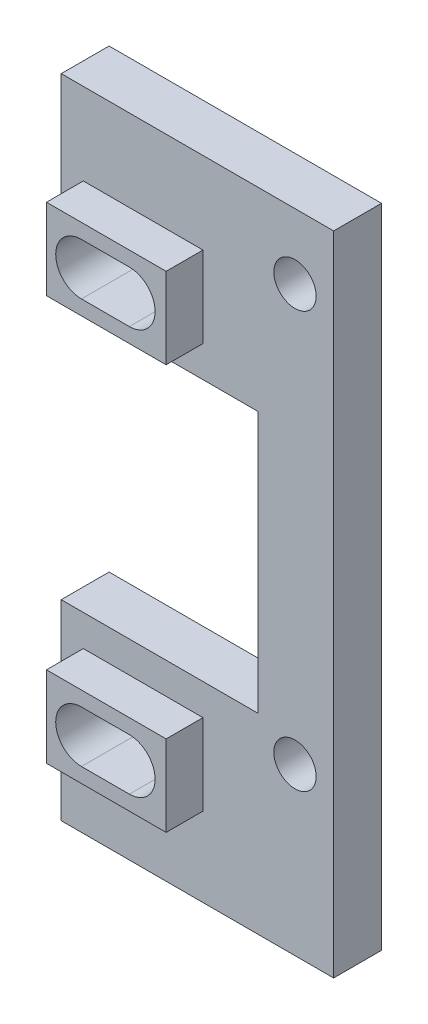
ISO-10303-21;
HEADER;
FILE_DESCRIPTION(('STEP AP214'),'2;1');
FILE_NAME('part.step','',(''),(''),'','','');
FILE_SCHEMA(('AUTOMOTIVE_DESIGN { 1 0 10303 214 1 1 1 1 }'));
ENDSEC;
DATA;
#1=APPLICATION_CONTEXT('core data for automotive mechanical design processes');
#2=APPLICATION_PROTOCOL_DEFINITION('international standard','automotive_design',2000,#1);
#3=PRODUCT_CONTEXT('',#1,'mechanical');
#4=PRODUCT('Part','Part','',(#3));
#5=PRODUCT_RELATED_PRODUCT_CATEGORY('part','',(#4));
#6=PRODUCT_DEFINITION_FORMATION('','',#4);
#7=PRODUCT_DEFINITION_CONTEXT('part definition',#1,'design');
#8=PRODUCT_DEFINITION('design','',#6,#7);
#9=PRODUCT_DEFINITION_SHAPE('','',#8);
#10=(LENGTH_UNIT() NAMED_UNIT(*) SI_UNIT(.MILLI.,.METRE.));
#11=(NAMED_UNIT(*) PLANE_ANGLE_UNIT() SI_UNIT($,.RADIAN.));
#12=(NAMED_UNIT(*) SI_UNIT($,.STERADIAN.) SOLID_ANGLE_UNIT());
#13=UNCERTAINTY_MEASURE_WITH_UNIT(LENGTH_MEASURE(1.E-05),#10,'distance_accuracy_value','');
#14=(GEOMETRIC_REPRESENTATION_CONTEXT(3) GLOBAL_UNCERTAINTY_ASSIGNED_CONTEXT((#13)) GLOBAL_UNIT_ASSIGNED_CONTEXT((#10,
#11,#12)) REPRESENTATION_CONTEXT('',''));
#15=CARTESIAN_POINT('',(0.,0.,0.));
#16=DIRECTION('',(0.,0.,1.));
#17=DIRECTION('',(1.,0.,0.));
#18=AXIS2_PLACEMENT_3D('',#15,#16,#17);
#19=CARTESIAN_POINT('',(0.,0.,2.6));
#20=DIRECTION('',(0.,0.,1.));
#21=DIRECTION('',(1.,0.,0.));
#22=AXIS2_PLACEMENT_3D('',#19,#20,#21);
#23=PLANE('',#22);
#24=DIRECTION('',(1.,0.,0.));
#25=VECTOR('',#24,1.);
#26=CARTESIAN_POINT('',(26.9,-27.7,2.6));
#27=LINE('',#26,#25);
#28=CARTESIAN_POINT('',(26.9,-27.7,2.6));
#29=VERTEX_POINT('',#28);
#30=CARTESIAN_POINT('',(33.4,-27.7,2.6));
#31=VERTEX_POINT('',#30);
#32=EDGE_CURVE('E269',#29,#31,#27,.T.);
#33=ORIENTED_EDGE('',*,*,#32,.F.);
#34=DIRECTION('',(0.,-1.,0.));
#35=VECTOR('',#34,1.);
#36=CARTESIAN_POINT('',(26.9,-23.3,2.6));
#37=LINE('',#36,#35);
#38=CARTESIAN_POINT('',(26.9,-23.3,2.6));
#39=VERTEX_POINT('',#38);
#40=EDGE_CURVE('E255',#39,#29,#37,.T.);
#41=ORIENTED_EDGE('',*,*,#40,.F.);
#42=DIRECTION('',(-1.,0.,0.));
#43=VECTOR('',#42,1.);
#44=CARTESIAN_POINT('',(33.4,-23.3,2.6));
#45=LINE('',#44,#43);
#46=CARTESIAN_POINT('',(33.4,-23.3,2.6));
#47=VERTEX_POINT('',#46);
#48=EDGE_CURVE('E260',#47,#39,#45,.T.);
#49=ORIENTED_EDGE('',*,*,#48,.F.);
#50=DIRECTION('',(0.,1.,0.));
#51=VECTOR('',#50,1.);
#52=CARTESIAN_POINT('',(33.4,-27.7,2.6));
#53=LINE('',#52,#51);
#54=EDGE_CURVE('E271',#31,#47,#53,.T.);
#55=ORIENTED_EDGE('',*,*,#54,.F.);
#56=EDGE_LOOP('',(#33,#41,#49,#55));
#57=FACE_BOUND('',#56,.T.);
#58=CARTESIAN_POINT('',(38.4,-23.,2.6));
#59=DIRECTION('',(0.,0.,1.));
#60=DIRECTION('',(1.,0.,0.));
#61=AXIS2_PLACEMENT_3D('',#58,#59,#60);
#62=CIRCLE('',#61,1.15);
#63=CARTESIAN_POINT('',(39.55,-23.,2.6));
#64=VERTEX_POINT('',#63);
#65=EDGE_CURVE('E325',#64,#64,#62,.T.);
#66=ORIENTED_EDGE('',*,*,#65,.F.);
#67=EDGE_LOOP('',(#66));
#68=FACE_BOUND('',#67,.T.);
#69=DIRECTION('',(0.,-1.,0.));
#70=VECTOR('',#69,1.);
#71=CARTESIAN_POINT('',(25.7,-21.6,2.6));
#72=LINE('',#71,#70);
#73=CARTESIAN_POINT('',(25.7,-21.6,2.6));
#74=VERTEX_POINT('',#73);
#75=CARTESIAN_POINT('',(25.7,-32.,2.6));
#76=VERTEX_POINT('',#75);
#77=EDGE_CURVE('E331',#74,#76,#72,.T.);
#78=ORIENTED_EDGE('',*,*,#77,.T.);
#79=DIRECTION('',(1.,0.,0.));
#80=VECTOR('',#79,1.);
#81=CARTESIAN_POINT('',(25.7,-32.,2.6));
#82=LINE('',#81,#80);
#83=CARTESIAN_POINT('',(40.5,-32.,2.6));
#84=VERTEX_POINT('',#83);
#85=EDGE_CURVE('E334',#76,#84,#82,.T.);
#86=ORIENTED_EDGE('',*,*,#85,.T.);
#87=DIRECTION('',(0.,1.,0.));
#88=VECTOR('',#87,1.);
#89=CARTESIAN_POINT('',(40.5,-32.,2.6));
#90=LINE('',#89,#88);
#91=CARTESIAN_POINT('',(40.5,3.15,2.6));
#92=VERTEX_POINT('',#91);
#93=EDGE_CURVE('E337',#84,#92,#90,.T.);
#94=ORIENTED_EDGE('',*,*,#93,.T.);
#95=DIRECTION('',(-1.,0.,0.));
#96=VECTOR('',#95,1.);
#97=CARTESIAN_POINT('',(40.5,3.15,2.6));
#98=LINE('',#97,#96);
#99=CARTESIAN_POINT('',(25.7,3.15,2.6));
#100=VERTEX_POINT('',#99);
#101=EDGE_CURVE('E339',#92,#100,#98,.T.);
#102=ORIENTED_EDGE('',*,*,#101,.T.);
#103=DIRECTION('',(0.,-1.,0.));
#104=VECTOR('',#103,1.);
#105=CARTESIAN_POINT('',(25.7,3.15,2.6));
#106=LINE('',#105,#104);
#107=CARTESIAN_POINT('',(25.7,-7.4,2.6));
#108=VERTEX_POINT('',#107);
#109=EDGE_CURVE('E341',#100,#108,#106,.T.);
#110=ORIENTED_EDGE('',*,*,#109,.T.);
#111=DIRECTION('',(1.,0.,0.));
#112=VECTOR('',#111,1.);
#113=CARTESIAN_POINT('',(25.7,-7.4,2.6));
#114=LINE('',#113,#112);
#115=CARTESIAN_POINT('',(36.4,-7.4,2.6));
#116=VERTEX_POINT('',#115);
#117=EDGE_CURVE('E343',#108,#116,#114,.T.);
#118=ORIENTED_EDGE('',*,*,#117,.T.);
#119=DIRECTION('',(0.,-1.,0.));
#120=VECTOR('',#119,1.);
#121=CARTESIAN_POINT('',(36.4,-7.4,2.6));
#122=LINE('',#121,#120);
#123=CARTESIAN_POINT('',(36.4,-21.6,2.6));
#124=VERTEX_POINT('',#123);
#125=EDGE_CURVE('E345',#116,#124,#122,.T.);
#126=ORIENTED_EDGE('',*,*,#125,.T.);
#127=DIRECTION('',(-1.,0.,0.));
#128=VECTOR('',#127,1.);
#129=CARTESIAN_POINT('',(36.4,-21.6,2.6));
#130=LINE('',#129,#128);
#131=EDGE_CURVE('E347',#124,#74,#130,.T.);
#132=ORIENTED_EDGE('',*,*,#131,.T.);
#133=EDGE_LOOP('',(#78,#86,#94,#102,#110,#118,#126,#132));
#134=FACE_BOUND('',#133,.T.);
#135=CARTESIAN_POINT('',(38.4,-0.4,2.6));
#136=DIRECTION('',(0.,0.,1.));
#137=DIRECTION('',(1.,0.,0.));
#138=AXIS2_PLACEMENT_3D('',#135,#136,#137);
#139=CIRCLE('',#138,1.15);
#140=CARTESIAN_POINT('',(39.55,-0.4,2.6));
#141=VERTEX_POINT('',#140);
#142=EDGE_CURVE('E319',#141,#141,#139,.T.);
#143=ORIENTED_EDGE('',*,*,#142,.F.);
#144=EDGE_LOOP('',(#143));
#145=FACE_BOUND('',#144,.T.);
#146=DIRECTION('',(1.,0.,0.));
#147=VECTOR('',#146,1.);
#148=CARTESIAN_POINT('',(26.9,-5.7,2.6));
#149=LINE('',#148,#147);
#150=CARTESIAN_POINT('',(26.9,-5.7,2.6));
#151=VERTEX_POINT('',#150);
#152=CARTESIAN_POINT('',(33.4,-5.7,2.6));
#153=VERTEX_POINT('',#152);
#154=EDGE_CURVE('E235',#151,#153,#149,.T.);
#155=ORIENTED_EDGE('',*,*,#154,.F.);
#156=DIRECTION('',(0.,-1.,0.));
#157=VECTOR('',#156,1.);
#158=CARTESIAN_POINT('',(26.9,-1.3,2.6));
#159=LINE('',#158,#157);
#160=CARTESIAN_POINT('',(26.9,-1.3,2.6));
#161=VERTEX_POINT('',#160);
#162=EDGE_CURVE('E232',#161,#151,#159,.T.);
#163=ORIENTED_EDGE('',*,*,#162,.F.);
#164=DIRECTION('',(-1.,0.,0.));
#165=VECTOR('',#164,1.);
#166=CARTESIAN_POINT('',(33.4,-1.3,2.6));
#167=LINE('',#166,#165);
#168=CARTESIAN_POINT('',(33.4,-1.3,2.6));
#169=VERTEX_POINT('',#168);
#170=EDGE_CURVE('E746',#169,#161,#167,.T.);
#171=ORIENTED_EDGE('',*,*,#170,.F.);
#172=DIRECTION('',(0.,1.,0.));
#173=VECTOR('',#172,1.);
#174=CARTESIAN_POINT('',(33.4,-5.7,2.6));
#175=LINE('',#174,#173);
#176=EDGE_CURVE('E753',#153,#169,#175,.T.);
#177=ORIENTED_EDGE('',*,*,#176,.F.);
#178=EDGE_LOOP('',(#155,#163,#171,#177));
#179=FACE_BOUND('',#178,.T.);
#180=ADVANCED_FACE('F43',(#57,#68,#134,#145,#179),#23,.T.);
#181=CARTESIAN_POINT('',(0.,0.,0.));
#182=DIRECTION('',(0.,0.,1.));
#183=DIRECTION('',(1.,0.,0.));
#184=AXIS2_PLACEMENT_3D('',#181,#182,#183);
#185=PLANE('',#184);
#186=CARTESIAN_POINT('',(28.8,-25.5,0.));
#187=DIRECTION('',(0.,0.,1.));
#188=DIRECTION('',(1.,0.,0.));
#189=AXIS2_PLACEMENT_3D('',#186,#187,#188);
#190=CIRCLE('',#189,1.4);
#191=CARTESIAN_POINT('',(28.8,-24.1,0.));
#192=VERTEX_POINT('',#191);
#193=CARTESIAN_POINT('',(28.8,-26.9,0.));
#194=VERTEX_POINT('',#193);
#195=EDGE_CURVE('E296',#192,#194,#190,.T.);
#196=ORIENTED_EDGE('',*,*,#195,.T.);
#197=DIRECTION('',(1.,0.,0.));
#198=VECTOR('',#197,1.);
#199=CARTESIAN_POINT('',(28.8,-26.9,0.));
#200=LINE('',#199,#198);
#201=CARTESIAN_POINT('',(31.4,-26.9,0.));
#202=VERTEX_POINT('',#201);
#203=EDGE_CURVE('E299',#194,#202,#200,.T.);
#204=ORIENTED_EDGE('',*,*,#203,.T.);
#205=CARTESIAN_POINT('',(31.4,-25.5,0.));
#206=DIRECTION('',(0.,0.,1.));
#207=DIRECTION('',(1.,0.,0.));
#208=AXIS2_PLACEMENT_3D('',#205,#206,#207);
#209=CIRCLE('',#208,1.4);
#210=CARTESIAN_POINT('',(31.4,-24.1,0.));
#211=VERTEX_POINT('',#210);
#212=EDGE_CURVE('E302',#202,#211,#209,.T.);
#213=ORIENTED_EDGE('',*,*,#212,.T.);
#214=DIRECTION('',(-1.,0.,0.));
#215=VECTOR('',#214,1.);
#216=CARTESIAN_POINT('',(31.4,-24.1,0.));
#217=LINE('',#216,#215);
#218=EDGE_CURVE('E305',#211,#192,#217,.T.);
#219=ORIENTED_EDGE('',*,*,#218,.T.);
#220=EDGE_LOOP('',(#196,#204,#213,#219));
#221=FACE_BOUND('',#220,.T.);
#222=DIRECTION('',(0.,-1.,0.));
#223=VECTOR('',#222,1.);
#224=CARTESIAN_POINT('',(25.7,-21.6,0.));
#225=LINE('',#224,#223);
#226=CARTESIAN_POINT('',(25.7,-21.6,0.));
#227=VERTEX_POINT('',#226);
#228=CARTESIAN_POINT('',(25.7,-32.,0.));
#229=VERTEX_POINT('',#228);
#230=EDGE_CURVE('E328',#227,#229,#225,.T.);
#231=ORIENTED_EDGE('',*,*,#230,.F.);
#232=DIRECTION('',(-1.,0.,0.));
#233=VECTOR('',#232,1.);
#234=CARTESIAN_POINT('',(36.4,-21.6,0.));
#235=LINE('',#234,#233);
#236=CARTESIAN_POINT('',(36.4,-21.6,0.));
#237=VERTEX_POINT('',#236);
#238=EDGE_CURVE('E335',#237,#227,#235,.T.);
#239=ORIENTED_EDGE('',*,*,#238,.F.);
#240=DIRECTION('',(0.,-1.,0.));
#241=VECTOR('',#240,1.);
#242=CARTESIAN_POINT('',(36.4,-7.4,0.));
#243=LINE('',#242,#241);
#244=CARTESIAN_POINT('',(36.4,-7.4,0.));
#245=VERTEX_POINT('',#244);
#246=EDGE_CURVE('E362',#245,#237,#243,.T.);
#247=ORIENTED_EDGE('',*,*,#246,.F.);
#248=DIRECTION('',(1.,0.,0.));
#249=VECTOR('',#248,1.);
#250=CARTESIAN_POINT('',(25.7,-7.4,0.));
#251=LINE('',#250,#249);
#252=CARTESIAN_POINT('',(25.7,-7.4,0.));
#253=VERTEX_POINT('',#252);
#254=EDGE_CURVE('E360',#253,#245,#251,.T.);
#255=ORIENTED_EDGE('',*,*,#254,.F.);
#256=DIRECTION('',(0.,-1.,0.));
#257=VECTOR('',#256,1.);
#258=CARTESIAN_POINT('',(25.7,3.15,0.));
#259=LINE('',#258,#257);
#260=CARTESIAN_POINT('',(25.7,3.15,0.));
#261=VERTEX_POINT('',#260);
#262=EDGE_CURVE('E358',#261,#253,#259,.T.);
#263=ORIENTED_EDGE('',*,*,#262,.F.);
#264=DIRECTION('',(-1.,0.,0.));
#265=VECTOR('',#264,1.);
#266=CARTESIAN_POINT('',(40.5,3.15,0.));
#267=LINE('',#266,#265);
#268=CARTESIAN_POINT('',(40.5,3.15,0.));
#269=VERTEX_POINT('',#268);
#270=EDGE_CURVE('E356',#269,#261,#267,.T.);
#271=ORIENTED_EDGE('',*,*,#270,.F.);
#272=DIRECTION('',(0.,1.,0.));
#273=VECTOR('',#272,1.);
#274=CARTESIAN_POINT('',(40.5,-32.,0.));
#275=LINE('',#274,#273);
#276=CARTESIAN_POINT('',(40.5,-32.,0.));
#277=VERTEX_POINT('',#276);
#278=EDGE_CURVE('E354',#277,#269,#275,.T.);
#279=ORIENTED_EDGE('',*,*,#278,.F.);
#280=DIRECTION('',(1.,0.,0.));
#281=VECTOR('',#280,1.);
#282=CARTESIAN_POINT('',(25.7,-32.,0.));
#283=LINE('',#282,#281);
#284=EDGE_CURVE('E352',#229,#277,#283,.T.);
#285=ORIENTED_EDGE('',*,*,#284,.F.);
#286=EDGE_LOOP('',(#231,#239,#247,#255,#263,#271,#279,#285));
#287=FACE_BOUND('',#286,.T.);
#288=CARTESIAN_POINT('',(38.4,-23.,0.));
#289=DIRECTION('',(0.,0.,1.));
#290=DIRECTION('',(1.,0.,0.));
#291=AXIS2_PLACEMENT_3D('',#288,#289,#290);
#292=CIRCLE('',#291,1.15);
#293=CARTESIAN_POINT('',(39.55,-23.,0.));
#294=VERTEX_POINT('',#293);
#295=EDGE_CURVE('E322',#294,#294,#292,.T.);
#296=ORIENTED_EDGE('',*,*,#295,.T.);
#297=EDGE_LOOP('',(#296));
#298=FACE_BOUND('',#297,.T.);
#299=CARTESIAN_POINT('',(38.4,-0.4,0.));
#300=DIRECTION('',(0.,0.,1.));
#301=DIRECTION('',(1.,0.,0.));
#302=AXIS2_PLACEMENT_3D('',#299,#300,#301);
#303=CIRCLE('',#302,1.15);
#304=CARTESIAN_POINT('',(39.55,-0.4,0.));
#305=VERTEX_POINT('',#304);
#306=EDGE_CURVE('E318',#305,#305,#303,.T.);
#307=ORIENTED_EDGE('',*,*,#306,.T.);
#308=EDGE_LOOP('',(#307));
#309=FACE_BOUND('',#308,.T.);
#310=CARTESIAN_POINT('',(28.8,-3.5,0.));
#311=DIRECTION('',(0.,0.,1.));
#312=DIRECTION('',(1.,0.,0.));
#313=AXIS2_PLACEMENT_3D('',#310,#311,#312);
#314=CIRCLE('',#313,1.4);
#315=CARTESIAN_POINT('',(28.8,-2.1,0.));
#316=VERTEX_POINT('',#315);
#317=CARTESIAN_POINT('',(28.8,-4.9,0.));
#318=VERTEX_POINT('',#317);
#319=EDGE_CURVE('E282',#316,#318,#314,.T.);
#320=ORIENTED_EDGE('',*,*,#319,.T.);
#321=DIRECTION('',(1.,0.,0.));
#322=VECTOR('',#321,1.);
#323=CARTESIAN_POINT('',(28.8,-4.9,0.));
#324=LINE('',#323,#322);
#325=CARTESIAN_POINT('',(31.4,-4.9,0.));
#326=VERTEX_POINT('',#325);
#327=EDGE_CURVE('E285',#318,#326,#324,.T.);
#328=ORIENTED_EDGE('',*,*,#327,.T.);
#329=CARTESIAN_POINT('',(31.4,-3.5,0.));
#330=DIRECTION('',(0.,0.,1.));
#331=DIRECTION('',(1.,0.,0.));
#332=AXIS2_PLACEMENT_3D('',#329,#330,#331);
#333=CIRCLE('',#332,1.4);
#334=CARTESIAN_POINT('',(31.4,-2.1,0.));
#335=VERTEX_POINT('',#334);
#336=EDGE_CURVE('E288',#326,#335,#333,.T.);
#337=ORIENTED_EDGE('',*,*,#336,.T.);
#338=DIRECTION('',(-1.,0.,0.));
#339=VECTOR('',#338,1.);
#340=CARTESIAN_POINT('',(31.4,-2.1,0.));
#341=LINE('',#340,#339);
#342=EDGE_CURVE('E214',#335,#316,#341,.T.);
#343=ORIENTED_EDGE('',*,*,#342,.T.);
#344=EDGE_LOOP('',(#320,#328,#337,#343));
#345=FACE_BOUND('',#344,.T.);
#346=ADVANCED_FACE('F392',(#221,#287,#298,#309,#345),#185,.F.);
#347=CARTESIAN_POINT('',(25.7,-21.6,2.6));
#348=DIRECTION('',(1.,0.,0.));
#349=DIRECTION('',(0.,0.,-1.));
#350=AXIS2_PLACEMENT_3D('',#347,#348,#349);
#351=PLANE('',#350);
#352=ORIENTED_EDGE('',*,*,#230,.T.);
#353=DIRECTION('',(0.,0.,-1.));
#354=VECTOR('',#353,1.);
#355=CARTESIAN_POINT('',(25.7,-32.,2.6));
#356=LINE('',#355,#354);
#357=EDGE_CURVE('E11',#76,#229,#356,.T.);
#358=ORIENTED_EDGE('',*,*,#357,.F.);
#359=ORIENTED_EDGE('',*,*,#77,.F.);
#360=DIRECTION('',(0.,0.,-1.));
#361=VECTOR('',#360,1.);
#362=CARTESIAN_POINT('',(25.7,-21.6,2.6));
#363=LINE('',#362,#361);
#364=EDGE_CURVE('E349',#74,#227,#363,.T.);
#365=ORIENTED_EDGE('',*,*,#364,.T.);
#366=EDGE_LOOP('',(#352,#358,#359,#365));
#367=FACE_BOUND('',#366,.T.);
#368=ADVANCED_FACE('F45',(#367),#351,.F.);
#369=CARTESIAN_POINT('',(25.7,-32.,2.6));
#370=DIRECTION('',(0.,1.,0.));
#371=DIRECTION('',(0.,0.,1.));
#372=AXIS2_PLACEMENT_3D('',#369,#370,#371);
#373=PLANE('',#372);
#374=ORIENTED_EDGE('',*,*,#284,.T.);
#375=DIRECTION('',(0.,0.,-1.));
#376=VECTOR('',#375,1.);
#377=CARTESIAN_POINT('',(40.5,-32.,2.6));
#378=LINE('',#377,#376);
#379=EDGE_CURVE('E51',#84,#277,#378,.T.);
#380=ORIENTED_EDGE('',*,*,#379,.F.);
#381=ORIENTED_EDGE('',*,*,#85,.F.);
#382=ORIENTED_EDGE('',*,*,#357,.T.);
#383=EDGE_LOOP('',(#374,#380,#381,#382));
#384=FACE_BOUND('',#383,.T.);
#385=ADVANCED_FACE('F410',(#384),#373,.F.);
#386=CARTESIAN_POINT('',(40.5,-32.,2.6));
#387=DIRECTION('',(-1.,0.,0.));
#388=DIRECTION('',(0.,0.,1.));
#389=AXIS2_PLACEMENT_3D('',#386,#387,#388);
#390=PLANE('',#389);
#391=ORIENTED_EDGE('',*,*,#278,.T.);
#392=DIRECTION('',(0.,0.,-1.));
#393=VECTOR('',#392,1.);
#394=CARTESIAN_POINT('',(40.5,3.15,2.6));
#395=LINE('',#394,#393);
#396=EDGE_CURVE('E379',#92,#269,#395,.T.);
#397=ORIENTED_EDGE('',*,*,#396,.F.);
#398=ORIENTED_EDGE('',*,*,#93,.F.);
#399=ORIENTED_EDGE('',*,*,#379,.T.);
#400=EDGE_LOOP('',(#391,#397,#398,#399));
#401=FACE_BOUND('',#400,.T.);
#402=ADVANCED_FACE('F386',(#401),#390,.F.);
#403=CARTESIAN_POINT('',(40.5,3.15,2.6));
#404=DIRECTION('',(0.,-1.,0.));
#405=DIRECTION('',(0.,0.,-1.));
#406=AXIS2_PLACEMENT_3D('',#403,#404,#405);
#407=PLANE('',#406);
#408=ORIENTED_EDGE('',*,*,#270,.T.);
#409=DIRECTION('',(0.,0.,-1.));
#410=VECTOR('',#409,1.);
#411=CARTESIAN_POINT('',(25.7,3.15,2.6));
#412=LINE('',#411,#410);
#413=EDGE_CURVE('E376',#100,#261,#412,.T.);
#414=ORIENTED_EDGE('',*,*,#413,.F.);
#415=ORIENTED_EDGE('',*,*,#101,.F.);
#416=ORIENTED_EDGE('',*,*,#396,.T.);
#417=EDGE_LOOP('',(#408,#414,#415,#416));
#418=FACE_BOUND('',#417,.T.);
#419=ADVANCED_FACE('F398',(#418),#407,.F.);
#420=CARTESIAN_POINT('',(25.7,3.15,2.6));
#421=DIRECTION('',(1.,0.,0.));
#422=DIRECTION('',(0.,0.,-1.));
#423=AXIS2_PLACEMENT_3D('',#420,#421,#422);
#424=PLANE('',#423);
#425=ORIENTED_EDGE('',*,*,#262,.T.);
#426=DIRECTION('',(0.,0.,-1.));
#427=VECTOR('',#426,1.);
#428=CARTESIAN_POINT('',(25.7,-7.4,2.6));
#429=LINE('',#428,#427);
#430=EDGE_CURVE('E373',#108,#253,#429,.T.);
#431=ORIENTED_EDGE('',*,*,#430,.F.);
#432=ORIENTED_EDGE('',*,*,#109,.F.);
#433=ORIENTED_EDGE('',*,*,#413,.T.);
#434=EDGE_LOOP('',(#425,#431,#432,#433));
#435=FACE_BOUND('',#434,.T.);
#436=ADVANCED_FACE('F402',(#435),#424,.F.);
#437=CARTESIAN_POINT('',(25.7,-7.4,2.6));
#438=DIRECTION('',(0.,1.,0.));
#439=DIRECTION('',(0.,0.,1.));
#440=AXIS2_PLACEMENT_3D('',#437,#438,#439);
#441=PLANE('',#440);
#442=ORIENTED_EDGE('',*,*,#254,.T.);
#443=DIRECTION('',(0.,0.,-1.));
#444=VECTOR('',#443,1.);
#445=CARTESIAN_POINT('',(36.4,-7.4,2.6));
#446=LINE('',#445,#444);
#447=EDGE_CURVE('E370',#116,#245,#446,.T.);
#448=ORIENTED_EDGE('',*,*,#447,.F.);
#449=ORIENTED_EDGE('',*,*,#117,.F.);
#450=ORIENTED_EDGE('',*,*,#430,.T.);
#451=EDGE_LOOP('',(#442,#448,#449,#450));
#452=FACE_BOUND('',#451,.T.);
#453=ADVANCED_FACE('F423',(#452),#441,.F.);
#454=CARTESIAN_POINT('',(36.4,-7.4,2.6));
#455=DIRECTION('',(1.,0.,0.));
#456=DIRECTION('',(0.,0.,-1.));
#457=AXIS2_PLACEMENT_3D('',#454,#455,#456);
#458=PLANE('',#457);
#459=ORIENTED_EDGE('',*,*,#246,.T.);
#460=DIRECTION('',(0.,0.,-1.));
#461=VECTOR('',#460,1.);
#462=CARTESIAN_POINT('',(36.4,-21.6,2.6));
#463=LINE('',#462,#461);
#464=EDGE_CURVE('E367',#124,#237,#463,.T.);
#465=ORIENTED_EDGE('',*,*,#464,.F.);
#466=ORIENTED_EDGE('',*,*,#125,.F.);
#467=ORIENTED_EDGE('',*,*,#447,.T.);
#468=EDGE_LOOP('',(#459,#465,#466,#467));
#469=FACE_BOUND('',#468,.T.);
#470=ADVANCED_FACE('F421',(#469),#458,.F.);
#471=CARTESIAN_POINT('',(36.4,-21.6,2.6));
#472=DIRECTION('',(0.,-1.,0.));
#473=DIRECTION('',(0.,0.,-1.));
#474=AXIS2_PLACEMENT_3D('',#471,#472,#473);
#475=PLANE('',#474);
#476=ORIENTED_EDGE('',*,*,#238,.T.);
#477=ORIENTED_EDGE('',*,*,#364,.F.);
#478=ORIENTED_EDGE('',*,*,#131,.F.);
#479=ORIENTED_EDGE('',*,*,#464,.T.);
#480=EDGE_LOOP('',(#476,#477,#478,#479));
#481=FACE_BOUND('',#480,.T.);
#482=ADVANCED_FACE('F416',(#481),#475,.F.);
#483=CARTESIAN_POINT('',(38.4,-23.,2.6));
#484=DIRECTION('',(0.,0.,-1.));
#485=DIRECTION('',(-1.,0.,0.));
#486=AXIS2_PLACEMENT_3D('',#483,#484,#485);
#487=CYLINDRICAL_SURFACE('',#486,1.15);
#488=ORIENTED_EDGE('',*,*,#65,.T.);
#489=EDGE_LOOP('',(#488));
#490=FACE_BOUND('',#489,.T.);
#491=ORIENTED_EDGE('',*,*,#295,.F.);
#492=EDGE_LOOP('',(#491));
#493=FACE_BOUND('',#492,.T.);
#494=ADVANCED_FACE('F445',(#490,#493),#487,.F.);
#495=CARTESIAN_POINT('',(38.4,-0.4,2.6));
#496=DIRECTION('',(0.,0.,-1.));
#497=DIRECTION('',(-1.,0.,0.));
#498=AXIS2_PLACEMENT_3D('',#495,#496,#497);
#499=CYLINDRICAL_SURFACE('',#498,1.15);
#500=ORIENTED_EDGE('',*,*,#142,.T.);
#501=EDGE_LOOP('',(#500));
#502=FACE_BOUND('',#501,.T.);
#503=ORIENTED_EDGE('',*,*,#306,.F.);
#504=EDGE_LOOP('',(#503));
#505=FACE_BOUND('',#504,.T.);
#506=ADVANCED_FACE('F452',(#502,#505),#499,.F.);
#507=CARTESIAN_POINT('',(28.8,-25.5,2.6));
#508=DIRECTION('',(0.,0.,-1.));
#509=DIRECTION('',(-1.,0.,0.));
#510=AXIS2_PLACEMENT_3D('',#507,#508,#509);
#511=CYLINDRICAL_SURFACE('',#510,1.4);
#512=ORIENTED_EDGE('',*,*,#195,.F.);
#513=DIRECTION('',(0.,0.,-1.));
#514=VECTOR('',#513,1.);
#515=CARTESIAN_POINT('',(28.8,-24.1,2.6));
#516=LINE('',#515,#514);
#517=CARTESIAN_POINT('',(28.8,-24.1,4.6));
#518=VERTEX_POINT('',#517);
#519=EDGE_CURVE('E308',#518,#192,#516,.T.);
#520=ORIENTED_EDGE('',*,*,#519,.F.);
#521=CARTESIAN_POINT('',(28.8,-25.5,4.6));
#522=DIRECTION('',(0.,0.,1.));
#523=DIRECTION('',(1.,0.,0.));
#524=AXIS2_PLACEMENT_3D('',#521,#522,#523);
#525=CIRCLE('',#524,1.4);
#526=CARTESIAN_POINT('',(28.8,-26.9,4.6));
#527=VERTEX_POINT('',#526);
#528=EDGE_CURVE('E243',#518,#527,#525,.T.);
#529=ORIENTED_EDGE('',*,*,#528,.T.);
#530=DIRECTION('',(0.,0.,-1.));
#531=VECTOR('',#530,1.);
#532=CARTESIAN_POINT('',(28.8,-26.9,2.6));
#533=LINE('',#532,#531);
#534=EDGE_CURVE('E315',#527,#194,#533,.T.);
#535=ORIENTED_EDGE('',*,*,#534,.T.);
#536=EDGE_LOOP('',(#512,#520,#529,#535));
#537=FACE_BOUND('',#536,.T.);
#538=ADVANCED_FACE('F456',(#537),#511,.F.);
#539=CARTESIAN_POINT('',(28.8,-26.9,2.6));
#540=DIRECTION('',(0.,1.,0.));
#541=DIRECTION('',(0.,0.,1.));
#542=AXIS2_PLACEMENT_3D('',#539,#540,#541);
#543=PLANE('',#542);
#544=ORIENTED_EDGE('',*,*,#203,.F.);
#545=ORIENTED_EDGE('',*,*,#534,.F.);
#546=DIRECTION('',(1.,0.,0.));
#547=VECTOR('',#546,1.);
#548=CARTESIAN_POINT('',(28.8,-26.9,4.6));
#549=LINE('',#548,#547);
#550=CARTESIAN_POINT('',(31.4,-26.9,4.6));
#551=VERTEX_POINT('',#550);
#552=EDGE_CURVE('E246',#527,#551,#549,.T.);
#553=ORIENTED_EDGE('',*,*,#552,.T.);
#554=DIRECTION('',(0.,0.,-1.));
#555=VECTOR('',#554,1.);
#556=CARTESIAN_POINT('',(31.4,-26.9,2.6));
#557=LINE('',#556,#555);
#558=EDGE_CURVE('E313',#551,#202,#557,.T.);
#559=ORIENTED_EDGE('',*,*,#558,.T.);
#560=EDGE_LOOP('',(#544,#545,#553,#559));
#561=FACE_BOUND('',#560,.T.);
#562=ADVANCED_FACE('F485',(#561),#543,.T.);
#563=CARTESIAN_POINT('',(31.4,-25.5,2.6));
#564=DIRECTION('',(0.,0.,-1.));
#565=DIRECTION('',(-1.,0.,0.));
#566=AXIS2_PLACEMENT_3D('',#563,#564,#565);
#567=CYLINDRICAL_SURFACE('',#566,1.4);
#568=ORIENTED_EDGE('',*,*,#212,.F.);
#569=ORIENTED_EDGE('',*,*,#558,.F.);
#570=CARTESIAN_POINT('',(31.4,-25.5,4.6));
#571=DIRECTION('',(0.,0.,1.));
#572=DIRECTION('',(1.,0.,0.));
#573=AXIS2_PLACEMENT_3D('',#570,#571,#572);
#574=CIRCLE('',#573,1.4);
#575=CARTESIAN_POINT('',(31.4,-24.1,4.6));
#576=VERTEX_POINT('',#575);
#577=EDGE_CURVE('E249',#551,#576,#574,.T.);
#578=ORIENTED_EDGE('',*,*,#577,.T.);
#579=DIRECTION('',(0.,0.,-1.));
#580=VECTOR('',#579,1.);
#581=CARTESIAN_POINT('',(31.4,-24.1,2.6));
#582=LINE('',#581,#580);
#583=EDGE_CURVE('E311',#576,#211,#582,.T.);
#584=ORIENTED_EDGE('',*,*,#583,.T.);
#585=EDGE_LOOP('',(#568,#569,#578,#584));
#586=FACE_BOUND('',#585,.T.);
#587=ADVANCED_FACE('F481',(#586),#567,.F.);
#588=CARTESIAN_POINT('',(31.4,-24.1,2.6));
#589=DIRECTION('',(0.,-1.,0.));
#590=DIRECTION('',(0.,0.,-1.));
#591=AXIS2_PLACEMENT_3D('',#588,#589,#590);
#592=PLANE('',#591);
#593=ORIENTED_EDGE('',*,*,#218,.F.);
#594=ORIENTED_EDGE('',*,*,#583,.F.);
#595=DIRECTION('',(-1.,0.,0.));
#596=VECTOR('',#595,1.);
#597=CARTESIAN_POINT('',(31.4,-24.1,4.6));
#598=LINE('',#597,#596);
#599=EDGE_CURVE('E252',#576,#518,#598,.T.);
#600=ORIENTED_EDGE('',*,*,#599,.T.);
#601=ORIENTED_EDGE('',*,*,#519,.T.);
#602=EDGE_LOOP('',(#593,#594,#600,#601));
#603=FACE_BOUND('',#602,.T.);
#604=ADVANCED_FACE('F475',(#603),#592,.T.);
#605=CARTESIAN_POINT('',(28.8,-3.5,2.6));
#606=DIRECTION('',(0.,0.,-1.));
#607=DIRECTION('',(-1.,0.,0.));
#608=AXIS2_PLACEMENT_3D('',#605,#606,#607);
#609=CYLINDRICAL_SURFACE('',#608,1.4);
#610=ORIENTED_EDGE('',*,*,#319,.F.);
#611=DIRECTION('',(0.,0.,-1.));
#612=VECTOR('',#611,1.);
#613=CARTESIAN_POINT('',(28.8,-2.1,2.6));
#614=LINE('',#613,#612);
#615=CARTESIAN_POINT('',(28.8,-2.1,4.6));
#616=VERTEX_POINT('',#615);
#617=EDGE_CURVE('E219',#616,#316,#614,.T.);
#618=ORIENTED_EDGE('',*,*,#617,.F.);
#619=CARTESIAN_POINT('',(28.8,-3.5,4.6));
#620=DIRECTION('',(0.,0.,1.));
#621=DIRECTION('',(1.,0.,0.));
#622=AXIS2_PLACEMENT_3D('',#619,#620,#621);
#623=CIRCLE('',#622,1.4);
#624=CARTESIAN_POINT('',(28.8,-4.9,4.6));
#625=VERTEX_POINT('',#624);
#626=EDGE_CURVE('E231',#616,#625,#623,.T.);
#627=ORIENTED_EDGE('',*,*,#626,.T.);
#628=DIRECTION('',(0.,0.,-1.));
#629=VECTOR('',#628,1.);
#630=CARTESIAN_POINT('',(28.8,-4.9,2.6));
#631=LINE('',#630,#629);
#632=EDGE_CURVE('E293',#625,#318,#631,.T.);
#633=ORIENTED_EDGE('',*,*,#632,.T.);
#634=EDGE_LOOP('',(#610,#618,#627,#633));
#635=FACE_BOUND('',#634,.T.);
#636=ADVANCED_FACE('F465',(#635),#609,.F.);
#637=CARTESIAN_POINT('',(28.8,-4.9,2.6));
#638=DIRECTION('',(0.,1.,0.));
#639=DIRECTION('',(0.,0.,1.));
#640=AXIS2_PLACEMENT_3D('',#637,#638,#639);
#641=PLANE('',#640);
#642=ORIENTED_EDGE('',*,*,#327,.F.);
#643=ORIENTED_EDGE('',*,*,#632,.F.);
#644=DIRECTION('',(1.,0.,0.));
#645=VECTOR('',#644,1.);
#646=CARTESIAN_POINT('',(28.8,-4.9,4.6));
#647=LINE('',#646,#645);
#648=CARTESIAN_POINT('',(31.4,-4.9,4.6));
#649=VERTEX_POINT('',#648);
#650=EDGE_CURVE('E227',#625,#649,#647,.T.);
#651=ORIENTED_EDGE('',*,*,#650,.T.);
#652=DIRECTION('',(0.,0.,-1.));
#653=VECTOR('',#652,1.);
#654=CARTESIAN_POINT('',(31.4,-4.9,2.6));
#655=LINE('',#654,#653);
#656=EDGE_CURVE('E218',#649,#326,#655,.T.);
#657=ORIENTED_EDGE('',*,*,#656,.T.);
#658=EDGE_LOOP('',(#642,#643,#651,#657));
#659=FACE_BOUND('',#658,.T.);
#660=ADVANCED_FACE('F467',(#659),#641,.T.);
#661=CARTESIAN_POINT('',(31.4,-3.5,2.6));
#662=DIRECTION('',(0.,0.,-1.));
#663=DIRECTION('',(-1.,0.,0.));
#664=AXIS2_PLACEMENT_3D('',#661,#662,#663);
#665=CYLINDRICAL_SURFACE('',#664,1.4);
#666=ORIENTED_EDGE('',*,*,#336,.F.);
#667=ORIENTED_EDGE('',*,*,#656,.F.);
#668=CARTESIAN_POINT('',(31.4,-3.5,4.6));
#669=DIRECTION('',(0.,0.,1.));
#670=DIRECTION('',(1.,0.,0.));
#671=AXIS2_PLACEMENT_3D('',#668,#669,#670);
#672=CIRCLE('',#671,1.4);
#673=CARTESIAN_POINT('',(31.4,-2.1,4.6));
#674=VERTEX_POINT('',#673);
#675=EDGE_CURVE('E222',#649,#674,#672,.T.);
#676=ORIENTED_EDGE('',*,*,#675,.T.);
#677=DIRECTION('',(0.,0.,-1.));
#678=VECTOR('',#677,1.);
#679=CARTESIAN_POINT('',(31.4,-2.1,2.6));
#680=LINE('',#679,#678);
#681=EDGE_CURVE('E206',#674,#335,#680,.T.);
#682=ORIENTED_EDGE('',*,*,#681,.T.);
#683=EDGE_LOOP('',(#666,#667,#676,#682));
#684=FACE_BOUND('',#683,.T.);
#685=ADVANCED_FACE('F223',(#684),#665,.F.);
#686=CARTESIAN_POINT('',(31.4,-2.1,2.6));
#687=DIRECTION('',(0.,-1.,0.));
#688=DIRECTION('',(0.,0.,-1.));
#689=AXIS2_PLACEMENT_3D('',#686,#687,#688);
#690=PLANE('',#689);
#691=ORIENTED_EDGE('',*,*,#342,.F.);
#692=ORIENTED_EDGE('',*,*,#681,.F.);
#693=DIRECTION('',(-1.,0.,0.));
#694=VECTOR('',#693,1.);
#695=CARTESIAN_POINT('',(31.4,-2.1,4.6));
#696=LINE('',#695,#694);
#697=EDGE_CURVE('E211',#674,#616,#696,.T.);
#698=ORIENTED_EDGE('',*,*,#697,.T.);
#699=ORIENTED_EDGE('',*,*,#617,.T.);
#700=EDGE_LOOP('',(#691,#692,#698,#699));
#701=FACE_BOUND('',#700,.T.);
#702=ADVANCED_FACE('F208',(#701),#690,.T.);
#703=CARTESIAN_POINT('',(0.,0.,4.6));
#704=DIRECTION('',(0.,0.,1.));
#705=DIRECTION('',(1.,0.,0.));
#706=AXIS2_PLACEMENT_3D('',#703,#704,#705);
#707=PLANE('',#706);
#708=DIRECTION('',(0.,-1.,0.));
#709=VECTOR('',#708,1.);
#710=CARTESIAN_POINT('',(26.9,-23.3,4.6));
#711=LINE('',#710,#709);
#712=CARTESIAN_POINT('',(26.9,-23.3,4.6));
#713=VERTEX_POINT('',#712);
#714=CARTESIAN_POINT('',(26.9,-27.7,4.6));
#715=VERTEX_POINT('',#714);
#716=EDGE_CURVE('E256',#713,#715,#711,.T.);
#717=ORIENTED_EDGE('',*,*,#716,.T.);
#718=DIRECTION('',(1.,0.,0.));
#719=VECTOR('',#718,1.);
#720=CARTESIAN_POINT('',(26.9,-27.7,4.6));
#721=LINE('',#720,#719);
#722=CARTESIAN_POINT('',(33.4,-27.7,4.6));
#723=VERTEX_POINT('',#722);
#724=EDGE_CURVE('E259',#715,#723,#721,.T.);
#725=ORIENTED_EDGE('',*,*,#724,.T.);
#726=DIRECTION('',(0.,1.,0.));
#727=VECTOR('',#726,1.);
#728=CARTESIAN_POINT('',(33.4,-27.7,4.6));
#729=LINE('',#728,#727);
#730=CARTESIAN_POINT('',(33.4,-23.3,4.6));
#731=VERTEX_POINT('',#730);
#732=EDGE_CURVE('E262',#723,#731,#729,.T.);
#733=ORIENTED_EDGE('',*,*,#732,.T.);
#734=DIRECTION('',(-1.,0.,0.));
#735=VECTOR('',#734,1.);
#736=CARTESIAN_POINT('',(33.4,-23.3,4.6));
#737=LINE('',#736,#735);
#738=EDGE_CURVE('E264',#731,#713,#737,.T.);
#739=ORIENTED_EDGE('',*,*,#738,.T.);
#740=EDGE_LOOP('',(#717,#725,#733,#739));
#741=FACE_BOUND('',#740,.T.);
#742=ORIENTED_EDGE('',*,*,#552,.F.);
#743=ORIENTED_EDGE('',*,*,#528,.F.);
#744=ORIENTED_EDGE('',*,*,#599,.F.);
#745=ORIENTED_EDGE('',*,*,#577,.F.);
#746=EDGE_LOOP('',(#742,#743,#744,#745));
#747=FACE_BOUND('',#746,.T.);
#748=ADVANCED_FACE('F500',(#741,#747),#707,.T.);
#749=CARTESIAN_POINT('',(26.9,-23.3,4.6));
#750=DIRECTION('',(1.,0.,0.));
#751=DIRECTION('',(0.,0.,-1.));
#752=AXIS2_PLACEMENT_3D('',#749,#750,#751);
#753=PLANE('',#752);
#754=ORIENTED_EDGE('',*,*,#40,.T.);
#755=DIRECTION('',(0.,0.,-1.));
#756=VECTOR('',#755,1.);
#757=CARTESIAN_POINT('',(26.9,-27.7,4.6));
#758=LINE('',#757,#756);
#759=EDGE_CURVE('E280',#715,#29,#758,.T.);
#760=ORIENTED_EDGE('',*,*,#759,.F.);
#761=ORIENTED_EDGE('',*,*,#716,.F.);
#762=DIRECTION('',(0.,0.,-1.));
#763=VECTOR('',#762,1.);
#764=CARTESIAN_POINT('',(26.9,-23.3,4.6));
#765=LINE('',#764,#763);
#766=EDGE_CURVE('E266',#713,#39,#765,.T.);
#767=ORIENTED_EDGE('',*,*,#766,.T.);
#768=EDGE_LOOP('',(#754,#760,#761,#767));
#769=FACE_BOUND('',#768,.T.);
#770=ADVANCED_FACE('F502',(#769),#753,.F.);
#771=CARTESIAN_POINT('',(26.9,-27.7,4.6));
#772=DIRECTION('',(0.,1.,0.));
#773=DIRECTION('',(0.,0.,1.));
#774=AXIS2_PLACEMENT_3D('',#771,#772,#773);
#775=PLANE('',#774);
#776=ORIENTED_EDGE('',*,*,#32,.T.);
#777=DIRECTION('',(0.,0.,-1.));
#778=VECTOR('',#777,1.);
#779=CARTESIAN_POINT('',(33.4,-27.7,4.6));
#780=LINE('',#779,#778);
#781=EDGE_CURVE('E277',#723,#31,#780,.T.);
#782=ORIENTED_EDGE('',*,*,#781,.F.);
#783=ORIENTED_EDGE('',*,*,#724,.F.);
#784=ORIENTED_EDGE('',*,*,#759,.T.);
#785=EDGE_LOOP('',(#776,#782,#783,#784));
#786=FACE_BOUND('',#785,.T.);
#787=ADVANCED_FACE('F509',(#786),#775,.F.);
#788=CARTESIAN_POINT('',(33.4,-27.7,4.6));
#789=DIRECTION('',(-1.,0.,0.));
#790=DIRECTION('',(0.,0.,1.));
#791=AXIS2_PLACEMENT_3D('',#788,#789,#790);
#792=PLANE('',#791);
#793=ORIENTED_EDGE('',*,*,#54,.T.);
#794=DIRECTION('',(0.,0.,-1.));
#795=VECTOR('',#794,1.);
#796=CARTESIAN_POINT('',(33.4,-23.3,4.6));
#797=LINE('',#796,#795);
#798=EDGE_CURVE('E66',#731,#47,#797,.T.);
#799=ORIENTED_EDGE('',*,*,#798,.F.);
#800=ORIENTED_EDGE('',*,*,#732,.F.);
#801=ORIENTED_EDGE('',*,*,#781,.T.);
#802=EDGE_LOOP('',(#793,#799,#800,#801));
#803=FACE_BOUND('',#802,.T.);
#804=ADVANCED_FACE('F518',(#803),#792,.F.);
#805=CARTESIAN_POINT('',(33.4,-23.3,4.6));
#806=DIRECTION('',(0.,-1.,0.));
#807=DIRECTION('',(0.,0.,-1.));
#808=AXIS2_PLACEMENT_3D('',#805,#806,#807);
#809=PLANE('',#808);
#810=ORIENTED_EDGE('',*,*,#48,.T.);
#811=ORIENTED_EDGE('',*,*,#766,.F.);
#812=ORIENTED_EDGE('',*,*,#738,.F.);
#813=ORIENTED_EDGE('',*,*,#798,.T.);
#814=EDGE_LOOP('',(#810,#811,#812,#813));
#815=FACE_BOUND('',#814,.T.);
#816=ADVANCED_FACE('F515',(#815),#809,.F.);
#817=CARTESIAN_POINT('',(0.,0.,4.6));
#818=DIRECTION('',(0.,0.,1.));
#819=DIRECTION('',(1.,0.,0.));
#820=AXIS2_PLACEMENT_3D('',#817,#818,#819);
#821=PLANE('',#820);
#822=DIRECTION('',(0.,-1.,0.));
#823=VECTOR('',#822,1.);
#824=CARTESIAN_POINT('',(26.9,-1.3,4.6));
#825=LINE('',#824,#823);
#826=CARTESIAN_POINT('',(26.9,-1.3,4.6));
#827=VERTEX_POINT('',#826);
#828=CARTESIAN_POINT('',(26.9,-5.7,4.6));
#829=VERTEX_POINT('',#828);
#830=EDGE_CURVE('E238',#827,#829,#825,.T.);
#831=ORIENTED_EDGE('',*,*,#830,.T.);
#832=DIRECTION('',(1.,0.,0.));
#833=VECTOR('',#832,1.);
#834=CARTESIAN_POINT('',(26.9,-5.7,4.6));
#835=LINE('',#834,#833);
#836=CARTESIAN_POINT('',(33.4,-5.7,4.6));
#837=VERTEX_POINT('',#836);
#838=EDGE_CURVE('E767',#829,#837,#835,.T.);
#839=ORIENTED_EDGE('',*,*,#838,.T.);
#840=DIRECTION('',(0.,1.,0.));
#841=VECTOR('',#840,1.);
#842=CARTESIAN_POINT('',(33.4,-5.7,4.6));
#843=LINE('',#842,#841);
#844=CARTESIAN_POINT('',(33.4,-1.3,4.6));
#845=VERTEX_POINT('',#844);
#846=EDGE_CURVE('E766',#837,#845,#843,.T.);
#847=ORIENTED_EDGE('',*,*,#846,.T.);
#848=DIRECTION('',(-1.,0.,0.));
#849=VECTOR('',#848,1.);
#850=CARTESIAN_POINT('',(33.4,-1.3,4.6));
#851=LINE('',#850,#849);
#852=EDGE_CURVE('E758',#845,#827,#851,.T.);
#853=ORIENTED_EDGE('',*,*,#852,.T.);
#854=EDGE_LOOP('',(#831,#839,#847,#853));
#855=FACE_BOUND('',#854,.T.);
#856=ORIENTED_EDGE('',*,*,#650,.F.);
#857=ORIENTED_EDGE('',*,*,#626,.F.);
#858=ORIENTED_EDGE('',*,*,#697,.F.);
#859=ORIENTED_EDGE('',*,*,#675,.F.);
#860=EDGE_LOOP('',(#856,#857,#858,#859));
#861=FACE_BOUND('',#860,.T.);
#862=ADVANCED_FACE('F229',(#855,#861),#821,.T.);
#863=CARTESIAN_POINT('',(26.9,-1.3,4.6));
#864=DIRECTION('',(1.,0.,0.));
#865=DIRECTION('',(0.,0.,-1.));
#866=AXIS2_PLACEMENT_3D('',#863,#864,#865);
#867=PLANE('',#866);
#868=ORIENTED_EDGE('',*,*,#162,.T.);
#869=DIRECTION('',(0.,0.,-1.));
#870=VECTOR('',#869,1.);
#871=CARTESIAN_POINT('',(26.9,-5.7,4.6));
#872=LINE('',#871,#870);
#873=EDGE_CURVE('E768',#829,#151,#872,.T.);
#874=ORIENTED_EDGE('',*,*,#873,.F.);
#875=ORIENTED_EDGE('',*,*,#830,.F.);
#876=DIRECTION('',(0.,0.,-1.));
#877=VECTOR('',#876,1.);
#878=CARTESIAN_POINT('',(26.9,-1.3,4.6));
#879=LINE('',#878,#877);
#880=EDGE_CURVE('E748',#827,#161,#879,.T.);
#881=ORIENTED_EDGE('',*,*,#880,.T.);
#882=EDGE_LOOP('',(#868,#874,#875,#881));
#883=FACE_BOUND('',#882,.T.);
#884=ADVANCED_FACE('F553',(#883),#867,.F.);
#885=CARTESIAN_POINT('',(26.9,-5.7,4.6));
#886=DIRECTION('',(0.,1.,0.));
#887=DIRECTION('',(0.,0.,1.));
#888=AXIS2_PLACEMENT_3D('',#885,#886,#887);
#889=PLANE('',#888);
#890=ORIENTED_EDGE('',*,*,#154,.T.);
#891=DIRECTION('',(0.,0.,-1.));
#892=VECTOR('',#891,1.);
#893=CARTESIAN_POINT('',(33.4,-5.7,4.6));
#894=LINE('',#893,#892);
#895=EDGE_CURVE('E769',#837,#153,#894,.T.);
#896=ORIENTED_EDGE('',*,*,#895,.F.);
#897=ORIENTED_EDGE('',*,*,#838,.F.);
#898=ORIENTED_EDGE('',*,*,#873,.T.);
#899=EDGE_LOOP('',(#890,#896,#897,#898));
#900=FACE_BOUND('',#899,.T.);
#901=ADVANCED_FACE('F561',(#900),#889,.F.);
#902=CARTESIAN_POINT('',(33.4,-5.7,4.6));
#903=DIRECTION('',(-1.,0.,0.));
#904=DIRECTION('',(0.,0.,1.));
#905=AXIS2_PLACEMENT_3D('',#902,#903,#904);
#906=PLANE('',#905);
#907=ORIENTED_EDGE('',*,*,#176,.T.);
#908=DIRECTION('',(0.,0.,-1.));
#909=VECTOR('',#908,1.);
#910=CARTESIAN_POINT('',(33.4,-1.3,4.6));
#911=LINE('',#910,#909);
#912=EDGE_CURVE('E58',#845,#169,#911,.T.);
#913=ORIENTED_EDGE('',*,*,#912,.F.);
#914=ORIENTED_EDGE('',*,*,#846,.F.);
#915=ORIENTED_EDGE('',*,*,#895,.T.);
#916=EDGE_LOOP('',(#907,#913,#914,#915));
#917=FACE_BOUND('',#916,.T.);
#918=ADVANCED_FACE('F570',(#917),#906,.F.);
#919=CARTESIAN_POINT('',(33.4,-1.3,4.6));
#920=DIRECTION('',(0.,-1.,0.));
#921=DIRECTION('',(0.,0.,-1.));
#922=AXIS2_PLACEMENT_3D('',#919,#920,#921);
#923=PLANE('',#922);
#924=ORIENTED_EDGE('',*,*,#170,.T.);
#925=ORIENTED_EDGE('',*,*,#880,.F.);
#926=ORIENTED_EDGE('',*,*,#852,.F.);
#927=ORIENTED_EDGE('',*,*,#912,.T.);
#928=EDGE_LOOP('',(#924,#925,#926,#927));
#929=FACE_BOUND('',#928,.T.);
#930=ADVANCED_FACE('F579',(#929),#923,.F.);
#931=CLOSED_SHELL('',(#180,#346,#368,#385,#402,#419,#436,#453,#470,#482,#494,#506,#538,#562,
#587,#604,#636,#660,#685,#702,#748,#770,#787,#804,#816,#862,#884,#901,#918,#930));
#932=MANIFOLD_SOLID_BREP('B2',#931);
#933=ADVANCED_BREP_SHAPE_REPRESENTATION('',(#18,#932),#14);
#934=SHAPE_DEFINITION_REPRESENTATION(#9,#933);
ENDSEC;
END-ISO-10303-21;
